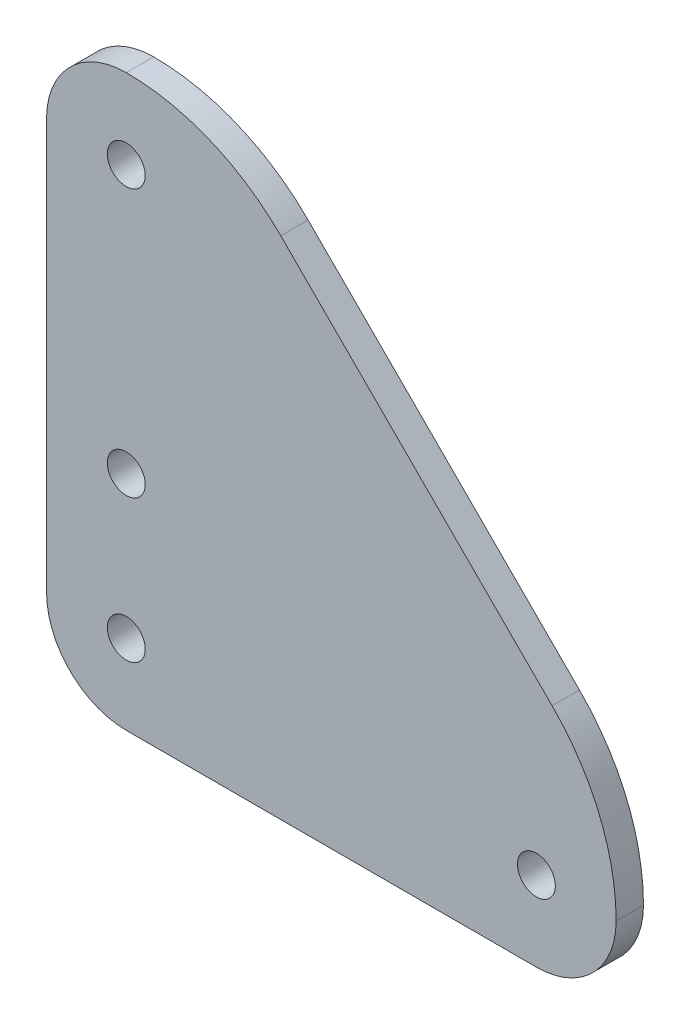
ISO-10303-21;
HEADER;
FILE_DESCRIPTION(('STEP AP214'),'2;1');
FILE_NAME('part.step','',(''),(''),'','','');
FILE_SCHEMA(('AUTOMOTIVE_DESIGN { 1 0 10303 214 1 1 1 1 }'));
ENDSEC;
DATA;
#1=APPLICATION_CONTEXT('core data for automotive mechanical design processes');
#2=APPLICATION_PROTOCOL_DEFINITION('international standard','automotive_design',2000,#1);
#3=PRODUCT_CONTEXT('',#1,'mechanical');
#4=PRODUCT('Part','Part','',(#3));
#5=PRODUCT_RELATED_PRODUCT_CATEGORY('part','',(#4));
#6=PRODUCT_DEFINITION_FORMATION('','',#4);
#7=PRODUCT_DEFINITION_CONTEXT('part definition',#1,'design');
#8=PRODUCT_DEFINITION('design','',#6,#7);
#9=PRODUCT_DEFINITION_SHAPE('','',#8);
#10=(LENGTH_UNIT() NAMED_UNIT(*) SI_UNIT(.MILLI.,.METRE.));
#11=(NAMED_UNIT(*) PLANE_ANGLE_UNIT() SI_UNIT($,.RADIAN.));
#12=(NAMED_UNIT(*) SI_UNIT($,.STERADIAN.) SOLID_ANGLE_UNIT());
#13=UNCERTAINTY_MEASURE_WITH_UNIT(LENGTH_MEASURE(1.E-05),#10,'distance_accuracy_value','');
#14=(GEOMETRIC_REPRESENTATION_CONTEXT(3) GLOBAL_UNCERTAINTY_ASSIGNED_CONTEXT((#13)) GLOBAL_UNIT_ASSIGNED_CONTEXT((#10,
#11,#12)) REPRESENTATION_CONTEXT('',''));
#15=CARTESIAN_POINT('',(0.,0.,0.));
#16=DIRECTION('',(0.,0.,1.));
#17=DIRECTION('',(1.,0.,0.));
#18=AXIS2_PLACEMENT_3D('',#15,#16,#17);
#19=CARTESIAN_POINT('',(0.,0.,-3.));
#20=DIRECTION('',(0.,0.,-1.));
#21=DIRECTION('',(-1.,0.,0.));
#22=AXIS2_PLACEMENT_3D('',#19,#20,#21);
#23=PLANE('',#22);
#24=CARTESIAN_POINT('',(21.5,111.5,-3.));
#25=DIRECTION('',(0.,0.,1.));
#26=DIRECTION('',(1.,0.,0.));
#27=AXIS2_PLACEMENT_3D('',#24,#25,#26);
#28=CIRCLE('',#27,4.15925);
#29=CARTESIAN_POINT('',(25.65925,111.5,-3.));
#30=VERTEX_POINT('',#29);
#31=EDGE_CURVE('E198',#30,#30,#28,.T.);
#32=ORIENTED_EDGE('',*,*,#31,.T.);
#33=EDGE_LOOP('',(#32));
#34=FACE_BOUND('',#33,.T.);
#35=CARTESIAN_POINT('',(21.5,52.7884,-3.));
#36=DIRECTION('',(0.,0.,1.));
#37=DIRECTION('',(1.,0.,0.));
#38=AXIS2_PLACEMENT_3D('',#35,#36,#37);
#39=CIRCLE('',#38,4.15925);
#40=CARTESIAN_POINT('',(25.65925,52.7884,-3.));
#41=VERTEX_POINT('',#40);
#42=EDGE_CURVE('E192',#41,#41,#39,.T.);
#43=ORIENTED_EDGE('',*,*,#42,.T.);
#44=EDGE_LOOP('',(#43));
#45=FACE_BOUND('',#44,.T.);
#46=CARTESIAN_POINT('',(21.5,21.5,-3.));
#47=DIRECTION('',(0.,0.,1.));
#48=DIRECTION('',(1.,0.,0.));
#49=AXIS2_PLACEMENT_3D('',#46,#47,#48);
#50=CIRCLE('',#49,4.15925);
#51=CARTESIAN_POINT('',(25.65925,21.5,-3.));
#52=VERTEX_POINT('',#51);
#53=EDGE_CURVE('E186',#52,#52,#50,.T.);
#54=ORIENTED_EDGE('',*,*,#53,.T.);
#55=EDGE_LOOP('',(#54));
#56=FACE_BOUND('',#55,.T.);
#57=CARTESIAN_POINT('',(81.0000147151093,21.4608800414897,-3.));
#58=DIRECTION('',(0.,0.,1.));
#59=DIRECTION('',(1.,0.,0.));
#60=AXIS2_PLACEMENT_3D('',#57,#58,#59);
#61=CIRCLE('',#60,48.);
#62=CARTESIAN_POINT('',(128.999999939322,21.4985426940124,-3.));
#63=VERTEX_POINT('',#62);
#64=CARTESIAN_POINT('',(114.941140212064,55.402005538444,-3.));
#65=VERTEX_POINT('',#64);
#66=EDGE_CURVE('E121',#63,#65,#61,.T.);
#67=ORIENTED_EDGE('',*,*,#66,.F.);
#68=CARTESIAN_POINT('',(111.5,21.5,-3.));
#69=DIRECTION('',(0.,0.,1.));
#70=DIRECTION('',(1.,0.,0.));
#71=AXIS2_PLACEMENT_3D('',#68,#69,#70);
#72=CIRCLE('',#71,17.5);
#73=CARTESIAN_POINT('',(111.5,4.00000000000001,-3.));
#74=VERTEX_POINT('',#73);
#75=EDGE_CURVE('E63',#74,#63,#72,.T.);
#76=ORIENTED_EDGE('',*,*,#75,.F.);
#77=DIRECTION('',(1.,0.,0.));
#78=VECTOR('',#77,1.);
#79=CARTESIAN_POINT('',(21.5,4.,-3.));
#80=LINE('',#79,#78);
#81=CARTESIAN_POINT('',(21.5,4.,-3.));
#82=VERTEX_POINT('',#81);
#83=EDGE_CURVE('E137',#82,#74,#80,.T.);
#84=ORIENTED_EDGE('',*,*,#83,.F.);
#85=CARTESIAN_POINT('',(21.5,21.5,-3.));
#86=DIRECTION('',(0.,0.,1.));
#87=DIRECTION('',(1.,0.,0.));
#88=AXIS2_PLACEMENT_3D('',#85,#86,#87);
#89=CIRCLE('',#88,17.5);
#90=CARTESIAN_POINT('',(4.,21.5,-3.));
#91=VERTEX_POINT('',#90);
#92=EDGE_CURVE('E134',#91,#82,#89,.T.);
#93=ORIENTED_EDGE('',*,*,#92,.F.);
#94=DIRECTION('',(0.,-1.,0.));
#95=VECTOR('',#94,1.);
#96=CARTESIAN_POINT('',(4.,111.5,-3.));
#97=LINE('',#96,#95);
#98=CARTESIAN_POINT('',(4.,111.5,-3.));
#99=VERTEX_POINT('',#98);
#100=EDGE_CURVE('E128',#99,#91,#97,.T.);
#101=ORIENTED_EDGE('',*,*,#100,.F.);
#102=CARTESIAN_POINT('',(21.5,111.5,-3.));
#103=DIRECTION('',(0.,0.,1.));
#104=DIRECTION('',(1.,0.,0.));
#105=AXIS2_PLACEMENT_3D('',#102,#103,#104);
#106=CIRCLE('',#105,17.5);
#107=CARTESIAN_POINT('',(21.4985426940171,128.999999939322,-3.));
#108=VERTEX_POINT('',#107);
#109=EDGE_CURVE('E126',#108,#99,#106,.T.);
#110=ORIENTED_EDGE('',*,*,#109,.F.);
#111=CARTESIAN_POINT('',(21.4608800414897,81.0000147151093,-3.));
#112=DIRECTION('',(0.,0.,1.));
#113=DIRECTION('',(1.,0.,0.));
#114=AXIS2_PLACEMENT_3D('',#111,#112,#113);
#115=CIRCLE('',#114,48.);
#116=CARTESIAN_POINT('',(55.402005538444,114.941140212064,-3.));
#117=VERTEX_POINT('',#116);
#118=EDGE_CURVE('E108',#117,#108,#115,.T.);
#119=ORIENTED_EDGE('',*,*,#118,.F.);
#120=DIRECTION('',(-0.707106781186547,0.707106781186548,0.));
#121=VECTOR('',#120,1.);
#122=CARTESIAN_POINT('',(114.941140212064,55.402005538444,-3.));
#123=LINE('',#122,#121);
#124=EDGE_CURVE('E116',#65,#117,#123,.T.);
#125=ORIENTED_EDGE('',*,*,#124,.F.);
#126=EDGE_LOOP('',(#67,#76,#84,#93,#101,#110,#119,#125));
#127=FACE_BOUND('',#126,.T.);
#128=CARTESIAN_POINT('',(111.5,21.5,-3.));
#129=DIRECTION('',(0.,0.,1.));
#130=DIRECTION('',(1.,0.,0.));
#131=AXIS2_PLACEMENT_3D('',#128,#129,#130);
#132=CIRCLE('',#131,4.15925);
#133=CARTESIAN_POINT('',(115.65925,21.5,-3.));
#134=VERTEX_POINT('',#133);
#135=EDGE_CURVE('E144',#134,#134,#132,.T.);
#136=ORIENTED_EDGE('',*,*,#135,.T.);
#137=EDGE_LOOP('',(#136));
#138=FACE_BOUND('',#137,.T.);
#139=ADVANCED_FACE('F39',(#34,#45,#56,#127,#138),#23,.T.);
#140=CARTESIAN_POINT('',(111.5,21.5,-3.));
#141=DIRECTION('',(0.,0.,1.));
#142=DIRECTION('',(1.,0.,0.));
#143=AXIS2_PLACEMENT_3D('',#140,#141,#142);
#144=CYLINDRICAL_SURFACE('',#143,17.5);
#145=CARTESIAN_POINT('',(111.5,21.5,3.));
#146=DIRECTION('',(0.,0.,1.));
#147=DIRECTION('',(1.,0.,0.));
#148=AXIS2_PLACEMENT_3D('',#145,#146,#147);
#149=CIRCLE('',#148,17.5);
#150=CARTESIAN_POINT('',(111.5,4.00000000000001,3.));
#151=VERTEX_POINT('',#150);
#152=CARTESIAN_POINT('',(128.999999939322,21.4985426940124,3.));
#153=VERTEX_POINT('',#152);
#154=EDGE_CURVE('E140',#151,#153,#149,.T.);
#155=ORIENTED_EDGE('',*,*,#154,.F.);
#156=DIRECTION('',(0.,0.,1.));
#157=VECTOR('',#156,1.);
#158=CARTESIAN_POINT('',(111.5,4.00000000000001,-3.));
#159=LINE('',#158,#157);
#160=EDGE_CURVE('E11',#74,#151,#159,.T.);
#161=ORIENTED_EDGE('',*,*,#160,.F.);
#162=ORIENTED_EDGE('',*,*,#75,.T.);
#163=DIRECTION('',(0.,0.,1.));
#164=VECTOR('',#163,1.);
#165=CARTESIAN_POINT('',(128.999999939322,21.4985426940124,-3.));
#166=LINE('',#165,#164);
#167=EDGE_CURVE('E42',#63,#153,#166,.T.);
#168=ORIENTED_EDGE('',*,*,#167,.T.);
#169=EDGE_LOOP('',(#155,#161,#162,#168));
#170=FACE_BOUND('',#169,.T.);
#171=ADVANCED_FACE('F169',(#170),#144,.T.);
#172=CARTESIAN_POINT('',(21.5,4.,-3.));
#173=DIRECTION('',(0.,-1.,0.));
#174=DIRECTION('',(1.,0.,0.));
#175=AXIS2_PLACEMENT_3D('',#172,#173,#174);
#176=PLANE('',#175);
#177=DIRECTION('',(1.,0.,0.));
#178=VECTOR('',#177,1.);
#179=CARTESIAN_POINT('',(21.5,4.,3.));
#180=LINE('',#179,#178);
#181=CARTESIAN_POINT('',(21.5,4.,3.));
#182=VERTEX_POINT('',#181);
#183=EDGE_CURVE('E158',#182,#151,#180,.T.);
#184=ORIENTED_EDGE('',*,*,#183,.F.);
#185=DIRECTION('',(0.,0.,1.));
#186=VECTOR('',#185,1.);
#187=CARTESIAN_POINT('',(21.5,4.,-3.));
#188=LINE('',#187,#186);
#189=EDGE_CURVE('E47',#82,#182,#188,.T.);
#190=ORIENTED_EDGE('',*,*,#189,.F.);
#191=ORIENTED_EDGE('',*,*,#83,.T.);
#192=ORIENTED_EDGE('',*,*,#160,.T.);
#193=EDGE_LOOP('',(#184,#190,#191,#192));
#194=FACE_BOUND('',#193,.T.);
#195=ADVANCED_FACE('F176',(#194),#176,.T.);
#196=CARTESIAN_POINT('',(21.5,21.5,-3.));
#197=DIRECTION('',(0.,0.,1.));
#198=DIRECTION('',(1.,0.,0.));
#199=AXIS2_PLACEMENT_3D('',#196,#197,#198);
#200=CYLINDRICAL_SURFACE('',#199,17.5);
#201=CARTESIAN_POINT('',(21.5,21.5,3.));
#202=DIRECTION('',(0.,0.,1.));
#203=DIRECTION('',(1.,0.,0.));
#204=AXIS2_PLACEMENT_3D('',#201,#202,#203);
#205=CIRCLE('',#204,17.5);
#206=CARTESIAN_POINT('',(4.,21.5,3.));
#207=VERTEX_POINT('',#206);
#208=EDGE_CURVE('E155',#207,#182,#205,.T.);
#209=ORIENTED_EDGE('',*,*,#208,.F.);
#210=DIRECTION('',(0.,0.,1.));
#211=VECTOR('',#210,1.);
#212=CARTESIAN_POINT('',(4.,21.5,-3.));
#213=LINE('',#212,#211);
#214=EDGE_CURVE('E162',#91,#207,#213,.T.);
#215=ORIENTED_EDGE('',*,*,#214,.F.);
#216=ORIENTED_EDGE('',*,*,#92,.T.);
#217=ORIENTED_EDGE('',*,*,#189,.T.);
#218=EDGE_LOOP('',(#209,#215,#216,#217));
#219=FACE_BOUND('',#218,.T.);
#220=ADVANCED_FACE('F314',(#219),#200,.T.);
#221=CARTESIAN_POINT('',(4.,111.5,-3.));
#222=DIRECTION('',(-1.,0.,0.));
#223=DIRECTION('',(0.,-1.,0.));
#224=AXIS2_PLACEMENT_3D('',#221,#222,#223);
#225=PLANE('',#224);
#226=DIRECTION('',(0.,-1.,0.));
#227=VECTOR('',#226,1.);
#228=CARTESIAN_POINT('',(4.,111.5,3.));
#229=LINE('',#228,#227);
#230=CARTESIAN_POINT('',(4.,111.5,3.));
#231=VERTEX_POINT('',#230);
#232=EDGE_CURVE('E152',#231,#207,#229,.T.);
#233=ORIENTED_EDGE('',*,*,#232,.F.);
#234=DIRECTION('',(0.,0.,1.));
#235=VECTOR('',#234,1.);
#236=CARTESIAN_POINT('',(4.,111.5,-3.));
#237=LINE('',#236,#235);
#238=EDGE_CURVE('E164',#99,#231,#237,.T.);
#239=ORIENTED_EDGE('',*,*,#238,.F.);
#240=ORIENTED_EDGE('',*,*,#100,.T.);
#241=ORIENTED_EDGE('',*,*,#214,.T.);
#242=EDGE_LOOP('',(#233,#239,#240,#241));
#243=FACE_BOUND('',#242,.T.);
#244=ADVANCED_FACE('F304',(#243),#225,.T.);
#245=CARTESIAN_POINT('',(21.5,111.5,-3.));
#246=DIRECTION('',(0.,0.,1.));
#247=DIRECTION('',(1.,0.,0.));
#248=AXIS2_PLACEMENT_3D('',#245,#246,#247);
#249=CYLINDRICAL_SURFACE('',#248,17.5);
#250=CARTESIAN_POINT('',(21.5,111.5,3.));
#251=DIRECTION('',(0.,0.,1.));
#252=DIRECTION('',(1.,0.,0.));
#253=AXIS2_PLACEMENT_3D('',#250,#251,#252);
#254=CIRCLE('',#253,17.5);
#255=CARTESIAN_POINT('',(21.4985426940171,128.999999939322,3.));
#256=VERTEX_POINT('',#255);
#257=EDGE_CURVE('E149',#256,#231,#254,.T.);
#258=ORIENTED_EDGE('',*,*,#257,.F.);
#259=DIRECTION('',(0.,0.,1.));
#260=VECTOR('',#259,1.);
#261=CARTESIAN_POINT('',(21.4985426940171,128.999999939322,-3.));
#262=LINE('',#261,#260);
#263=EDGE_CURVE('E112',#108,#256,#262,.T.);
#264=ORIENTED_EDGE('',*,*,#263,.F.);
#265=ORIENTED_EDGE('',*,*,#109,.T.);
#266=ORIENTED_EDGE('',*,*,#238,.T.);
#267=EDGE_LOOP('',(#258,#264,#265,#266));
#268=FACE_BOUND('',#267,.T.);
#269=ADVANCED_FACE('F295',(#268),#249,.T.);
#270=CARTESIAN_POINT('',(21.4608800414897,81.0000147151093,-3.));
#271=DIRECTION('',(0.,0.,1.));
#272=DIRECTION('',(1.,0.,0.));
#273=AXIS2_PLACEMENT_3D('',#270,#271,#272);
#274=CYLINDRICAL_SURFACE('',#273,48.);
#275=CARTESIAN_POINT('',(21.4608800414897,81.0000147151093,3.));
#276=DIRECTION('',(0.,0.,1.));
#277=DIRECTION('',(1.,0.,0.));
#278=AXIS2_PLACEMENT_3D('',#275,#276,#277);
#279=CIRCLE('',#278,48.);
#280=CARTESIAN_POINT('',(55.402005538444,114.941140212064,3.));
#281=VERTEX_POINT('',#280);
#282=EDGE_CURVE('E111',#281,#256,#279,.T.);
#283=ORIENTED_EDGE('',*,*,#282,.F.);
#284=DIRECTION('',(0.,0.,1.));
#285=VECTOR('',#284,1.);
#286=CARTESIAN_POINT('',(55.402005538444,114.941140212064,-3.));
#287=LINE('',#286,#285);
#288=EDGE_CURVE('E104',#117,#281,#287,.T.);
#289=ORIENTED_EDGE('',*,*,#288,.F.);
#290=ORIENTED_EDGE('',*,*,#118,.T.);
#291=ORIENTED_EDGE('',*,*,#263,.T.);
#292=EDGE_LOOP('',(#283,#289,#290,#291));
#293=FACE_BOUND('',#292,.T.);
#294=ADVANCED_FACE('F106',(#293),#274,.T.);
#295=CARTESIAN_POINT('',(114.941140212064,55.402005538444,-3.));
#296=DIRECTION('',(0.707106781186548,0.707106781186547,0.));
#297=DIRECTION('',(-0.707106781186547,0.707106781186548,0.));
#298=AXIS2_PLACEMENT_3D('',#295,#296,#297);
#299=PLANE('',#298);
#300=DIRECTION('',(-0.707106781186547,0.707106781186548,0.));
#301=VECTOR('',#300,1.);
#302=CARTESIAN_POINT('',(114.941140212064,55.402005538444,3.));
#303=LINE('',#302,#301);
#304=CARTESIAN_POINT('',(114.941140212064,55.402005538444,3.));
#305=VERTEX_POINT('',#304);
#306=EDGE_CURVE('E55',#305,#281,#303,.T.);
#307=ORIENTED_EDGE('',*,*,#306,.F.);
#308=DIRECTION('',(0.,0.,1.));
#309=VECTOR('',#308,1.);
#310=CARTESIAN_POINT('',(114.941140212064,55.402005538444,-3.));
#311=LINE('',#310,#309);
#312=EDGE_CURVE('E113',#65,#305,#311,.T.);
#313=ORIENTED_EDGE('',*,*,#312,.F.);
#314=ORIENTED_EDGE('',*,*,#124,.T.);
#315=ORIENTED_EDGE('',*,*,#288,.T.);
#316=EDGE_LOOP('',(#307,#313,#314,#315));
#317=FACE_BOUND('',#316,.T.);
#318=ADVANCED_FACE('F117',(#317),#299,.T.);
#319=CARTESIAN_POINT('',(81.0000147151093,21.4608800414897,-3.));
#320=DIRECTION('',(0.,0.,1.));
#321=DIRECTION('',(1.,0.,0.));
#322=AXIS2_PLACEMENT_3D('',#319,#320,#321);
#323=CYLINDRICAL_SURFACE('',#322,48.);
#324=CARTESIAN_POINT('',(81.0000147151093,21.4608800414897,3.));
#325=DIRECTION('',(0.,0.,1.));
#326=DIRECTION('',(1.,0.,0.));
#327=AXIS2_PLACEMENT_3D('',#324,#325,#326);
#328=CIRCLE('',#327,48.);
#329=EDGE_CURVE('E143',#153,#305,#328,.T.);
#330=ORIENTED_EDGE('',*,*,#329,.F.);
#331=ORIENTED_EDGE('',*,*,#167,.F.);
#332=ORIENTED_EDGE('',*,*,#66,.T.);
#333=ORIENTED_EDGE('',*,*,#312,.T.);
#334=EDGE_LOOP('',(#330,#331,#332,#333));
#335=FACE_BOUND('',#334,.T.);
#336=ADVANCED_FACE('F170',(#335),#323,.T.);
#337=CARTESIAN_POINT('',(0.,0.,3.));
#338=DIRECTION('',(0.,0.,-1.));
#339=DIRECTION('',(-1.,0.,0.));
#340=AXIS2_PLACEMENT_3D('',#337,#338,#339);
#341=PLANE('',#340);
#342=CARTESIAN_POINT('',(21.5,111.5,3.));
#343=DIRECTION('',(0.,0.,1.));
#344=DIRECTION('',(1.,0.,0.));
#345=AXIS2_PLACEMENT_3D('',#342,#343,#344);
#346=CIRCLE('',#345,4.15925);
#347=CARTESIAN_POINT('',(25.65925,111.5,3.));
#348=VERTEX_POINT('',#347);
#349=EDGE_CURVE('E201',#348,#348,#346,.T.);
#350=ORIENTED_EDGE('',*,*,#349,.F.);
#351=EDGE_LOOP('',(#350));
#352=FACE_BOUND('',#351,.T.);
#353=CARTESIAN_POINT('',(21.5,52.7884,3.));
#354=DIRECTION('',(0.,0.,1.));
#355=DIRECTION('',(1.,0.,0.));
#356=AXIS2_PLACEMENT_3D('',#353,#354,#355);
#357=CIRCLE('',#356,4.15925);
#358=CARTESIAN_POINT('',(25.65925,52.7884,3.));
#359=VERTEX_POINT('',#358);
#360=EDGE_CURVE('E195',#359,#359,#357,.T.);
#361=ORIENTED_EDGE('',*,*,#360,.F.);
#362=EDGE_LOOP('',(#361));
#363=FACE_BOUND('',#362,.T.);
#364=CARTESIAN_POINT('',(21.5,21.5,3.));
#365=DIRECTION('',(0.,0.,1.));
#366=DIRECTION('',(1.,0.,0.));
#367=AXIS2_PLACEMENT_3D('',#364,#365,#366);
#368=CIRCLE('',#367,4.15925);
#369=CARTESIAN_POINT('',(25.65925,21.5,3.));
#370=VERTEX_POINT('',#369);
#371=EDGE_CURVE('E189',#370,#370,#368,.T.);
#372=ORIENTED_EDGE('',*,*,#371,.F.);
#373=EDGE_LOOP('',(#372));
#374=FACE_BOUND('',#373,.T.);
#375=CARTESIAN_POINT('',(111.5,21.5,3.));
#376=DIRECTION('',(0.,0.,1.));
#377=DIRECTION('',(1.,0.,0.));
#378=AXIS2_PLACEMENT_3D('',#375,#376,#377);
#379=CIRCLE('',#378,4.15925);
#380=CARTESIAN_POINT('',(115.65925,21.5,3.));
#381=VERTEX_POINT('',#380);
#382=EDGE_CURVE('E183',#381,#381,#379,.T.);
#383=ORIENTED_EDGE('',*,*,#382,.F.);
#384=EDGE_LOOP('',(#383));
#385=FACE_BOUND('',#384,.T.);
#386=ORIENTED_EDGE('',*,*,#154,.T.);
#387=ORIENTED_EDGE('',*,*,#329,.T.);
#388=ORIENTED_EDGE('',*,*,#306,.T.);
#389=ORIENTED_EDGE('',*,*,#282,.T.);
#390=ORIENTED_EDGE('',*,*,#257,.T.);
#391=ORIENTED_EDGE('',*,*,#232,.T.);
#392=ORIENTED_EDGE('',*,*,#208,.T.);
#393=ORIENTED_EDGE('',*,*,#183,.T.);
#394=EDGE_LOOP('',(#386,#387,#388,#389,#390,#391,#392,#393));
#395=FACE_BOUND('',#394,.T.);
#396=ADVANCED_FACE('F172',(#352,#363,#374,#385,#395),#341,.F.);
#397=CARTESIAN_POINT('',(111.5,21.5,3.));
#398=DIRECTION('',(0.,0.,1.));
#399=DIRECTION('',(1.,0.,0.));
#400=AXIS2_PLACEMENT_3D('',#397,#398,#399);
#401=CYLINDRICAL_SURFACE('',#400,4.15925);
#402=ORIENTED_EDGE('',*,*,#135,.F.);
#403=EDGE_LOOP('',(#402));
#404=FACE_BOUND('',#403,.T.);
#405=ORIENTED_EDGE('',*,*,#382,.T.);
#406=EDGE_LOOP('',(#405));
#407=FACE_BOUND('',#406,.T.);
#408=ADVANCED_FACE('F209',(#404,#407),#401,.F.);
#409=CARTESIAN_POINT('',(21.5,21.5,3.));
#410=DIRECTION('',(0.,0.,1.));
#411=DIRECTION('',(1.,0.,0.));
#412=AXIS2_PLACEMENT_3D('',#409,#410,#411);
#413=CYLINDRICAL_SURFACE('',#412,4.15925);
#414=ORIENTED_EDGE('',*,*,#53,.F.);
#415=EDGE_LOOP('',(#414));
#416=FACE_BOUND('',#415,.T.);
#417=ORIENTED_EDGE('',*,*,#371,.T.);
#418=EDGE_LOOP('',(#417));
#419=FACE_BOUND('',#418,.T.);
#420=ADVANCED_FACE('F217',(#416,#419),#413,.F.);
#421=CARTESIAN_POINT('',(21.5,52.7884,3.));
#422=DIRECTION('',(0.,0.,1.));
#423=DIRECTION('',(1.,0.,0.));
#424=AXIS2_PLACEMENT_3D('',#421,#422,#423);
#425=CYLINDRICAL_SURFACE('',#424,4.15925);
#426=ORIENTED_EDGE('',*,*,#42,.F.);
#427=EDGE_LOOP('',(#426));
#428=FACE_BOUND('',#427,.T.);
#429=ORIENTED_EDGE('',*,*,#360,.T.);
#430=EDGE_LOOP('',(#429));
#431=FACE_BOUND('',#430,.T.);
#432=ADVANCED_FACE('F223',(#428,#431),#425,.F.);
#433=CARTESIAN_POINT('',(21.5,111.5,3.));
#434=DIRECTION('',(0.,0.,1.));
#435=DIRECTION('',(1.,0.,0.));
#436=AXIS2_PLACEMENT_3D('',#433,#434,#435);
#437=CYLINDRICAL_SURFACE('',#436,4.15925);
#438=ORIENTED_EDGE('',*,*,#31,.F.);
#439=EDGE_LOOP('',(#438));
#440=FACE_BOUND('',#439,.T.);
#441=ORIENTED_EDGE('',*,*,#349,.T.);
#442=EDGE_LOOP('',(#441));
#443=FACE_BOUND('',#442,.T.);
#444=ADVANCED_FACE('F205',(#440,#443),#437,.F.);
#445=CLOSED_SHELL('',(#139,#171,#195,#220,#244,#269,#294,#318,#336,#396,#408,#420,#432,#444));
#446=MANIFOLD_SOLID_BREP('B2',#445);
#447=ADVANCED_BREP_SHAPE_REPRESENTATION('',(#18,#446),#14);
#448=SHAPE_DEFINITION_REPRESENTATION(#9,#447);
ENDSEC;
END-ISO-10303-21;
